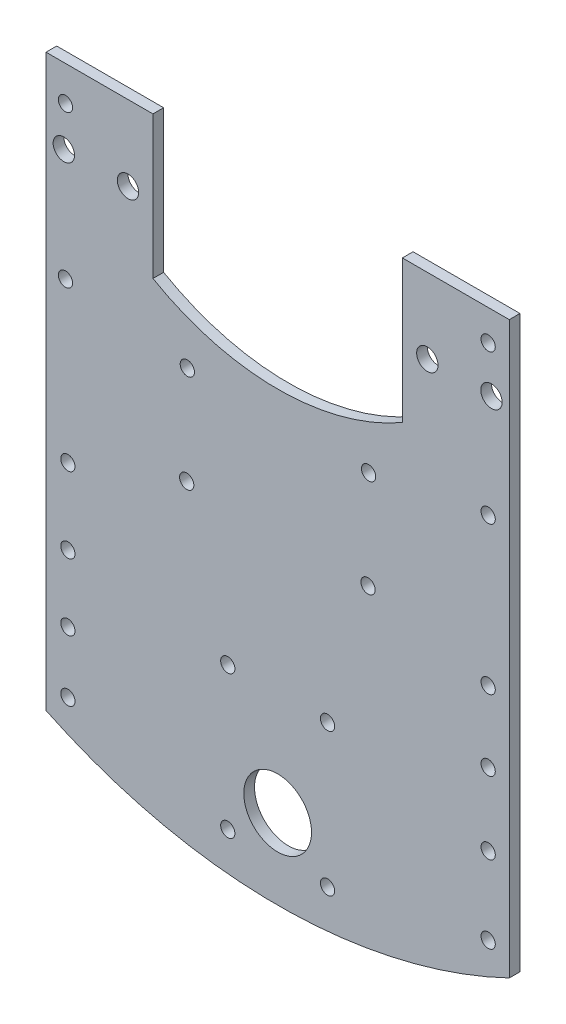
ISO-10303-21;
HEADER;
FILE_DESCRIPTION(('STEP AP214'),'2;1');
FILE_NAME('part.step','',(''),(''),'','','');
FILE_SCHEMA(('AUTOMOTIVE_DESIGN { 1 0 10303 214 1 1 1 1 }'));
ENDSEC;
DATA;
#1=APPLICATION_CONTEXT('core data for automotive mechanical design processes');
#2=APPLICATION_PROTOCOL_DEFINITION('international standard','automotive_design',2000,#1);
#3=PRODUCT_CONTEXT('',#1,'mechanical');
#4=PRODUCT('Part','Part','',(#3));
#5=PRODUCT_RELATED_PRODUCT_CATEGORY('part','',(#4));
#6=PRODUCT_DEFINITION_FORMATION('','',#4);
#7=PRODUCT_DEFINITION_CONTEXT('part definition',#1,'design');
#8=PRODUCT_DEFINITION('design','',#6,#7);
#9=PRODUCT_DEFINITION_SHAPE('','',#8);
#10=(LENGTH_UNIT() NAMED_UNIT(*) SI_UNIT(.MILLI.,.METRE.));
#11=(NAMED_UNIT(*) PLANE_ANGLE_UNIT() SI_UNIT($,.RADIAN.));
#12=(NAMED_UNIT(*) SI_UNIT($,.STERADIAN.) SOLID_ANGLE_UNIT());
#13=UNCERTAINTY_MEASURE_WITH_UNIT(LENGTH_MEASURE(1.E-05),#10,'distance_accuracy_value','');
#14=(GEOMETRIC_REPRESENTATION_CONTEXT(3) GLOBAL_UNCERTAINTY_ASSIGNED_CONTEXT((#13)) GLOBAL_UNIT_ASSIGNED_CONTEXT((#10,
#11,#12)) REPRESENTATION_CONTEXT('',''));
#15=CARTESIAN_POINT('',(0.,0.,0.));
#16=DIRECTION('',(0.,0.,1.));
#17=DIRECTION('',(1.,0.,0.));
#18=AXIS2_PLACEMENT_3D('',#15,#16,#17);
#19=CARTESIAN_POINT('',(0.82033483000224,16.841601103084,3.));
#20=DIRECTION('',(0.,0.,1.));
#21=DIRECTION('',(1.,0.,0.));
#22=AXIS2_PLACEMENT_3D('',#19,#20,#21);
#23=PLANE('',#22);
#24=CARTESIAN_POINT('',(-58.7353248928425,31.901332055439,3.));
#25=DIRECTION('',(0.,0.,1.));
#26=DIRECTION('',(1.,0.,0.));
#27=AXIS2_PLACEMENT_3D('',#24,#25,#26);
#28=CIRCLE('',#27,2.);
#29=CARTESIAN_POINT('',(-56.7353248928425,31.901332055439,3.));
#30=VERTEX_POINT('',#29);
#31=EDGE_CURVE('E494',#30,#30,#28,.T.);
#32=ORIENTED_EDGE('',*,*,#31,.F.);
#33=EDGE_LOOP('',(#32));
#34=FACE_BOUND('',#33,.T.);
#35=CARTESIAN_POINT('',(59.8926878247371,-112.115366711053,3.));
#36=DIRECTION('',(0.,0.,1.));
#37=DIRECTION('',(1.,0.,0.));
#38=AXIS2_PLACEMENT_3D('',#35,#36,#37);
#39=CIRCLE('',#38,2.);
#40=CARTESIAN_POINT('',(61.8926878247371,-112.115366711053,3.));
#41=VERTEX_POINT('',#40);
#42=EDGE_CURVE('E502',#41,#41,#39,.T.);
#43=ORIENTED_EDGE('',*,*,#42,.F.);
#44=EDGE_LOOP('',(#43));
#45=FACE_BOUND('',#44,.T.);
#46=CARTESIAN_POINT('',(59.8926878247371,-90.4055847690872,3.));
#47=DIRECTION('',(0.,0.,1.));
#48=DIRECTION('',(1.,0.,0.));
#49=AXIS2_PLACEMENT_3D('',#46,#47,#48);
#50=CIRCLE('',#49,2.);
#51=CARTESIAN_POINT('',(61.8926878247371,-90.4055847690872,3.));
#52=VERTEX_POINT('',#51);
#53=EDGE_CURVE('E505',#52,#52,#50,.T.);
#54=ORIENTED_EDGE('',*,*,#53,.F.);
#55=EDGE_LOOP('',(#54));
#56=FACE_BOUND('',#55,.T.);
#57=CARTESIAN_POINT('',(59.8926878247371,-70.121992881703,3.));
#58=DIRECTION('',(0.,0.,1.));
#59=DIRECTION('',(1.,0.,0.));
#60=AXIS2_PLACEMENT_3D('',#57,#58,#59);
#61=CIRCLE('',#60,2.);
#62=CARTESIAN_POINT('',(61.8926878247371,-70.121992881703,3.));
#63=VERTEX_POINT('',#62);
#64=EDGE_CURVE('E508',#63,#63,#61,.T.);
#65=ORIENTED_EDGE('',*,*,#64,.F.);
#66=EDGE_LOOP('',(#65));
#67=FACE_BOUND('',#66,.T.);
#68=CARTESIAN_POINT('',(-58.7353248928425,-10.7596293906167,3.));
#69=DIRECTION('',(0.,0.,1.));
#70=DIRECTION('',(1.,0.,0.));
#71=AXIS2_PLACEMENT_3D('',#68,#69,#70);
#72=CIRCLE('',#71,2.);
#73=CARTESIAN_POINT('',(-56.7353248928425,-10.7596293906167,3.));
#74=VERTEX_POINT('',#73);
#75=EDGE_CURVE('E490',#74,#74,#72,.T.);
#76=ORIENTED_EDGE('',*,*,#75,.F.);
#77=EDGE_LOOP('',(#76));
#78=FACE_BOUND('',#77,.T.);
#79=CARTESIAN_POINT('',(-58.0507536666432,-55.0285686848329,3.));
#80=DIRECTION('',(0.,0.,1.));
#81=DIRECTION('',(1.,0.,0.));
#82=AXIS2_PLACEMENT_3D('',#79,#80,#81);
#83=CIRCLE('',#82,2.);
#84=CARTESIAN_POINT('',(-56.0507536666432,-55.0285686848329,3.));
#85=VERTEX_POINT('',#84);
#86=EDGE_CURVE('E493',#85,#85,#83,.T.);
#87=ORIENTED_EDGE('',*,*,#86,.F.);
#88=EDGE_LOOP('',(#87));
#89=FACE_BOUND('',#88,.T.);
#90=CARTESIAN_POINT('',(-58.0507536666432,-76.2502766970087,3.));
#91=DIRECTION('',(0.,0.,1.));
#92=DIRECTION('',(1.,0.,0.));
#93=AXIS2_PLACEMENT_3D('',#90,#91,#92);
#94=CIRCLE('',#93,2.);
#95=CARTESIAN_POINT('',(-56.0507536666432,-76.2502766970087,3.));
#96=VERTEX_POINT('',#95);
#97=EDGE_CURVE('E497',#96,#96,#94,.T.);
#98=ORIENTED_EDGE('',*,*,#97,.F.);
#99=EDGE_LOOP('',(#98));
#100=FACE_BOUND('',#99,.T.);
#101=CARTESIAN_POINT('',(-58.0507536666432,-94.9618902131206,3.));
#102=DIRECTION('',(0.,0.,1.));
#103=DIRECTION('',(1.,0.,0.));
#104=AXIS2_PLACEMENT_3D('',#101,#102,#103);
#105=CIRCLE('',#104,2.);
#106=CARTESIAN_POINT('',(-56.0507536666432,-94.9618902131206,3.));
#107=VERTEX_POINT('',#106);
#108=EDGE_CURVE('E489',#107,#107,#105,.T.);
#109=ORIENTED_EDGE('',*,*,#108,.F.);
#110=EDGE_LOOP('',(#109));
#111=FACE_BOUND('',#110,.T.);
#112=CARTESIAN_POINT('',(59.8926878247371,-50.255835401353,3.));
#113=DIRECTION('',(0.,0.,1.));
#114=DIRECTION('',(1.,0.,0.));
#115=AXIS2_PLACEMENT_3D('',#112,#113,#114);
#116=CIRCLE('',#115,2.);
#117=CARTESIAN_POINT('',(61.8926878247371,-50.255835401353,3.));
#118=VERTEX_POINT('',#117);
#119=EDGE_CURVE('E414',#118,#118,#116,.T.);
#120=ORIENTED_EDGE('',*,*,#119,.F.);
#121=EDGE_LOOP('',(#120));
#122=FACE_BOUND('',#121,.T.);
#123=CARTESIAN_POINT('',(59.8926878247371,-8.82591075219494,3.));
#124=DIRECTION('',(0.,0.,1.));
#125=DIRECTION('',(1.,0.,0.));
#126=AXIS2_PLACEMENT_3D('',#123,#124,#125);
#127=CIRCLE('',#126,2.);
#128=CARTESIAN_POINT('',(61.8926878247371,-8.82591075219494,3.));
#129=VERTEX_POINT('',#128);
#130=EDGE_CURVE('E516',#129,#129,#127,.T.);
#131=ORIENTED_EDGE('',*,*,#130,.F.);
#132=EDGE_LOOP('',(#131));
#133=FACE_BOUND('',#132,.T.);
#134=CARTESIAN_POINT('',(59.8926878247371,33.0331101704914,3.));
#135=DIRECTION('',(0.,0.,1.));
#136=DIRECTION('',(1.,0.,0.));
#137=AXIS2_PLACEMENT_3D('',#134,#135,#136);
#138=CIRCLE('',#137,2.);
#139=CARTESIAN_POINT('',(61.8926878247371,33.0331101704914,3.));
#140=VERTEX_POINT('',#139);
#141=EDGE_CURVE('E513',#140,#140,#138,.T.);
#142=ORIENTED_EDGE('',*,*,#141,.F.);
#143=EDGE_LOOP('',(#142));
#144=FACE_BOUND('',#143,.T.);
#145=CARTESIAN_POINT('',(-58.0507536666432,-112.076170868101,3.));
#146=DIRECTION('',(0.,0.,1.));
#147=DIRECTION('',(1.,0.,0.));
#148=AXIS2_PLACEMENT_3D('',#145,#146,#147);
#149=CIRCLE('',#148,2.);
#150=CARTESIAN_POINT('',(-56.0507536666432,-112.076170868101,3.));
#151=VERTEX_POINT('',#150);
#152=EDGE_CURVE('E170',#151,#151,#149,.T.);
#153=ORIENTED_EDGE('',*,*,#152,.F.);
#154=EDGE_LOOP('',(#153));
#155=FACE_BOUND('',#154,.T.);
#156=CARTESIAN_POINT('',(-24.6990644063407,-42.8702786135747,3.));
#157=DIRECTION('',(0.,0.,1.));
#158=DIRECTION('',(1.,0.,0.));
#159=AXIS2_PLACEMENT_3D('',#156,#157,#158);
#160=CIRCLE('',#159,2.);
#161=CARTESIAN_POINT('',(-22.6990644063407,-42.8702786135747,3.));
#162=VERTEX_POINT('',#161);
#163=EDGE_CURVE('E205',#162,#162,#160,.F.);
#164=ORIENTED_EDGE('',*,*,#163,.T.);
#165=EDGE_LOOP('',(#164));
#166=FACE_BOUND('',#165,.T.);
#167=CARTESIAN_POINT('',(-24.52945484201,-15.2902786135747,3.));
#168=DIRECTION('',(0.,0.,1.));
#169=DIRECTION('',(1.,0.,0.));
#170=AXIS2_PLACEMENT_3D('',#167,#168,#169);
#171=CIRCLE('',#170,2.);
#172=CARTESIAN_POINT('',(-22.52945484201,-15.2902786135747,3.));
#173=VERTEX_POINT('',#172);
#174=EDGE_CURVE('E213',#173,#173,#171,.F.);
#175=ORIENTED_EDGE('',*,*,#174,.T.);
#176=EDGE_LOOP('',(#175));
#177=FACE_BOUND('',#176,.T.);
#178=CARTESIAN_POINT('',(26.3397340663453,-15.2902786135748,3.));
#179=DIRECTION('',(0.,0.,1.));
#180=DIRECTION('',(1.,0.,0.));
#181=AXIS2_PLACEMENT_3D('',#178,#179,#180);
#182=CIRCLE('',#181,2.);
#183=CARTESIAN_POINT('',(28.3397340663453,-15.2902786135748,3.));
#184=VERTEX_POINT('',#183);
#185=EDGE_CURVE('E220',#184,#184,#182,.F.);
#186=ORIENTED_EDGE('',*,*,#185,.T.);
#187=EDGE_LOOP('',(#186));
#188=FACE_BOUND('',#187,.T.);
#189=CARTESIAN_POINT('',(26.1701245020146,-42.8702786135748,3.));
#190=DIRECTION('',(0.,0.,1.));
#191=DIRECTION('',(1.,0.,0.));
#192=AXIS2_PLACEMENT_3D('',#189,#190,#191);
#193=CIRCLE('',#192,2.);
#194=CARTESIAN_POINT('',(28.1701245020146,-42.8702786135748,3.));
#195=VERTEX_POINT('',#194);
#196=EDGE_CURVE('E219',#195,#195,#193,.F.);
#197=ORIENTED_EDGE('',*,*,#196,.T.);
#198=EDGE_LOOP('',(#197));
#199=FACE_BOUND('',#198,.T.);
#200=CARTESIAN_POINT('',(-13.1796651699263,-121.721678977984,3.));
#201=DIRECTION('',(0.,0.,1.));
#202=DIRECTION('',(1.,0.,0.));
#203=AXIS2_PLACEMENT_3D('',#200,#201,#202);
#204=CIRCLE('',#203,2.);
#205=CARTESIAN_POINT('',(-11.1796651699263,-121.721678977984,3.));
#206=VERTEX_POINT('',#205);
#207=EDGE_CURVE('E235',#206,#206,#204,.F.);
#208=ORIENTED_EDGE('',*,*,#207,.T.);
#209=EDGE_LOOP('',(#208));
#210=FACE_BOUND('',#209,.T.);
#211=CARTESIAN_POINT('',(-13.1796651699439,-81.7216789779836,3.));
#212=DIRECTION('',(0.,0.,1.));
#213=DIRECTION('',(1.,0.,0.));
#214=AXIS2_PLACEMENT_3D('',#211,#212,#213);
#215=CIRCLE('',#214,2.);
#216=CARTESIAN_POINT('',(-11.1796651699439,-81.7216789779836,3.));
#217=VERTEX_POINT('',#216);
#218=EDGE_CURVE('E228',#217,#217,#215,.F.);
#219=ORIENTED_EDGE('',*,*,#218,.T.);
#220=EDGE_LOOP('',(#219));
#221=FACE_BOUND('',#220,.T.);
#222=CARTESIAN_POINT('',(14.8203348300561,-81.7216789779713,3.));
#223=DIRECTION('',(0.,0.,1.));
#224=DIRECTION('',(1.,0.,0.));
#225=AXIS2_PLACEMENT_3D('',#222,#223,#224);
#226=CIRCLE('',#225,2.);
#227=CARTESIAN_POINT('',(16.8203348300561,-81.7216789779713,3.));
#228=VERTEX_POINT('',#227);
#229=EDGE_CURVE('E227',#228,#228,#226,.F.);
#230=ORIENTED_EDGE('',*,*,#229,.T.);
#231=EDGE_LOOP('',(#230));
#232=FACE_BOUND('',#231,.T.);
#233=CARTESIAN_POINT('',(14.8203348300737,-121.721678977971,3.));
#234=DIRECTION('',(0.,0.,1.));
#235=DIRECTION('',(1.,0.,0.));
#236=AXIS2_PLACEMENT_3D('',#233,#234,#235);
#237=CIRCLE('',#236,2.);
#238=CARTESIAN_POINT('',(16.8203348300737,-121.721678977971,3.));
#239=VERTEX_POINT('',#238);
#240=EDGE_CURVE('E244',#239,#239,#237,.F.);
#241=ORIENTED_EDGE('',*,*,#240,.T.);
#242=EDGE_LOOP('',(#241));
#243=FACE_BOUND('',#242,.T.);
#244=CARTESIAN_POINT('',(0.820334830002261,-110.721678977963,3.));
#245=DIRECTION('',(0.,0.,1.));
#246=DIRECTION('',(1.,0.,0.));
#247=AXIS2_PLACEMENT_3D('',#244,#245,#246);
#248=CIRCLE('',#247,9.49999999999999);
#249=CARTESIAN_POINT('',(10.3203348300023,-110.721678977963,3.));
#250=VERTEX_POINT('',#249);
#251=EDGE_CURVE('E165',#250,#250,#248,.T.);
#252=ORIENTED_EDGE('',*,*,#251,.F.);
#253=EDGE_LOOP('',(#252));
#254=FACE_BOUND('',#253,.T.);
#255=CARTESIAN_POINT('',(-59.1796651699977,20.5544747081712,3.));
#256=DIRECTION('',(0.,0.,1.));
#257=DIRECTION('',(-1.,0.,0.));
#258=AXIS2_PLACEMENT_3D('',#255,#256,#257);
#259=CIRCLE('',#258,3.);
#260=CARTESIAN_POINT('',(-62.1796651699977,20.5544747081712,3.));
#261=VERTEX_POINT('',#260);
#262=EDGE_CURVE('E255',#261,#261,#259,.T.);
#263=ORIENTED_EDGE('',*,*,#262,.F.);
#264=EDGE_LOOP('',(#263));
#265=FACE_BOUND('',#264,.T.);
#266=CARTESIAN_POINT('',(60.8203348300023,20.5544747081712,3.));
#267=DIRECTION('',(0.,0.,1.));
#268=DIRECTION('',(1.,0.,0.));
#269=AXIS2_PLACEMENT_3D('',#266,#267,#268);
#270=CIRCLE('',#269,3.00000000000001);
#271=CARTESIAN_POINT('',(63.8203348300023,20.5544747081712,3.));
#272=VERTEX_POINT('',#271);
#273=EDGE_CURVE('E138',#272,#272,#270,.T.);
#274=ORIENTED_EDGE('',*,*,#273,.F.);
#275=EDGE_LOOP('',(#274));
#276=FACE_BOUND('',#275,.T.);
#277=DIRECTION('',(-1.,0.,0.));
#278=VECTOR('',#277,1.);
#279=CARTESIAN_POINT('',(-34.1796651699977,41.6565427571263,3.));
#280=LINE('',#279,#278);
#281=CARTESIAN_POINT('',(-34.1796651699977,41.6565427571263,3.));
#282=VERTEX_POINT('',#281);
#283=CARTESIAN_POINT('',(-64.1796651699977,41.6565427571263,3.));
#284=VERTEX_POINT('',#283);
#285=EDGE_CURVE('E149',#282,#284,#280,.T.);
#286=ORIENTED_EDGE('',*,*,#285,.T.);
#287=DIRECTION('',(0.,-1.,0.));
#288=VECTOR('',#287,1.);
#289=CARTESIAN_POINT('',(-64.1796651699977,41.6565427571263,3.));
#290=LINE('',#289,#288);
#291=CARTESIAN_POINT('',(-64.1796651699978,-118.343457242874,3.));
#292=VERTEX_POINT('',#291);
#293=EDGE_CURVE('E97',#284,#292,#290,.T.);
#294=ORIENTED_EDGE('',*,*,#293,.T.);
#295=CARTESIAN_POINT('',(0.82033483000224,16.841601103084,3.));
#296=DIRECTION('',(0.,0.,1.));
#297=DIRECTION('',(1.,0.,0.));
#298=AXIS2_PLACEMENT_3D('',#295,#296,#297);
#299=CIRCLE('',#298,150.);
#300=CARTESIAN_POINT('',(65.8203348300023,-118.343457242874,3.));
#301=VERTEX_POINT('',#300);
#302=EDGE_CURVE('E273',#292,#301,#299,.T.);
#303=ORIENTED_EDGE('',*,*,#302,.T.);
#304=DIRECTION('',(0.,1.,0.));
#305=VECTOR('',#304,1.);
#306=CARTESIAN_POINT('',(65.8203348300023,-118.343457242874,3.));
#307=LINE('',#306,#305);
#308=CARTESIAN_POINT('',(65.8203348300023,41.6565427571263,3.));
#309=VERTEX_POINT('',#308);
#310=EDGE_CURVE('E275',#301,#309,#307,.T.);
#311=ORIENTED_EDGE('',*,*,#310,.T.);
#312=DIRECTION('',(-1.,0.,0.));
#313=VECTOR('',#312,1.);
#314=CARTESIAN_POINT('',(65.8203348300023,41.6565427571263,3.));
#315=LINE('',#314,#313);
#316=CARTESIAN_POINT('',(35.8203348300023,41.6565427571263,3.));
#317=VERTEX_POINT('',#316);
#318=EDGE_CURVE('E116',#309,#317,#315,.T.);
#319=ORIENTED_EDGE('',*,*,#318,.T.);
#320=DIRECTION('',(0.,-1.,0.));
#321=VECTOR('',#320,1.);
#322=CARTESIAN_POINT('',(35.8203348300023,41.6565427571263,3.));
#323=LINE('',#322,#321);
#324=CARTESIAN_POINT('',(35.8203348300023,1.65654275712631,3.));
#325=VERTEX_POINT('',#324);
#326=EDGE_CURVE('E110',#317,#325,#323,.T.);
#327=ORIENTED_EDGE('',*,*,#326,.T.);
#328=CARTESIAN_POINT('',(0.82033483000224,62.278321022037,3.));
#329=DIRECTION('',(0.,0.,-1.));
#330=DIRECTION('',(1.,0.,0.));
#331=AXIS2_PLACEMENT_3D('',#328,#329,#330);
#332=CIRCLE('',#331,70.);
#333=CARTESIAN_POINT('',(-34.1796651699977,1.65654275712625,3.));
#334=VERTEX_POINT('',#333);
#335=EDGE_CURVE('E114',#325,#334,#332,.T.);
#336=ORIENTED_EDGE('',*,*,#335,.T.);
#337=DIRECTION('',(0.,1.,0.));
#338=VECTOR('',#337,1.);
#339=CARTESIAN_POINT('',(-34.1796651699977,1.65654275712625,3.));
#340=LINE('',#339,#338);
#341=EDGE_CURVE('E54',#334,#282,#340,.T.);
#342=ORIENTED_EDGE('',*,*,#341,.T.);
#343=EDGE_LOOP('',(#286,#294,#303,#311,#319,#327,#336,#342));
#344=FACE_BOUND('',#343,.T.);
#345=CARTESIAN_POINT('',(42.8203348300023,20.5544747081712,3.));
#346=DIRECTION('',(0.,0.,1.));
#347=DIRECTION('',(1.,0.,0.));
#348=AXIS2_PLACEMENT_3D('',#345,#346,#347);
#349=CIRCLE('',#348,2.99999999999999);
#350=CARTESIAN_POINT('',(45.8203348300023,20.5544747081712,3.));
#351=VERTEX_POINT('',#350);
#352=EDGE_CURVE('E261',#351,#351,#349,.T.);
#353=ORIENTED_EDGE('',*,*,#352,.F.);
#354=EDGE_LOOP('',(#353));
#355=FACE_BOUND('',#354,.T.);
#356=CARTESIAN_POINT('',(-41.1796651699977,20.5544747081712,3.));
#357=DIRECTION('',(0.,0.,1.));
#358=DIRECTION('',(-1.,0.,0.));
#359=AXIS2_PLACEMENT_3D('',#356,#357,#358);
#360=CIRCLE('',#359,2.99999999999999);
#361=CARTESIAN_POINT('',(-44.1796651699977,20.5544747081712,3.));
#362=VERTEX_POINT('',#361);
#363=EDGE_CURVE('E249',#362,#362,#360,.T.);
#364=ORIENTED_EDGE('',*,*,#363,.F.);
#365=EDGE_LOOP('',(#364));
#366=FACE_BOUND('',#365,.T.);
#367=ADVANCED_FACE('F35',(#34,#45,#56,#67,#78,#89,#100,#111,#122,#133,#144,#155,#166,#177,#188,
#199,#210,#221,#232,#243,#254,#265,#276,#344,#355,#366),#23,.T.);
#368=CARTESIAN_POINT('',(0.82033483000224,16.841601103084,0.));
#369=DIRECTION('',(0.,0.,1.));
#370=DIRECTION('',(1.,0.,0.));
#371=AXIS2_PLACEMENT_3D('',#368,#369,#370);
#372=PLANE('',#371);
#373=CARTESIAN_POINT('',(-58.7353248928425,31.901332055439,0.));
#374=DIRECTION('',(0.,0.,1.));
#375=DIRECTION('',(1.,0.,0.));
#376=AXIS2_PLACEMENT_3D('',#373,#374,#375);
#377=CIRCLE('',#376,2.);
#378=CARTESIAN_POINT('',(-56.7353248928425,31.901332055439,0.));
#379=VERTEX_POINT('',#378);
#380=EDGE_CURVE('E39',#379,#379,#377,.T.);
#381=ORIENTED_EDGE('',*,*,#380,.T.);
#382=EDGE_LOOP('',(#381));
#383=FACE_BOUND('',#382,.T.);
#384=CARTESIAN_POINT('',(59.8926878247371,-112.115366711053,0.));
#385=DIRECTION('',(0.,0.,1.));
#386=DIRECTION('',(1.,0.,0.));
#387=AXIS2_PLACEMENT_3D('',#384,#385,#386);
#388=CIRCLE('',#387,2.);
#389=CARTESIAN_POINT('',(61.8926878247371,-112.115366711053,0.));
#390=VERTEX_POINT('',#389);
#391=EDGE_CURVE('E196',#390,#390,#388,.T.);
#392=ORIENTED_EDGE('',*,*,#391,.T.);
#393=EDGE_LOOP('',(#392));
#394=FACE_BOUND('',#393,.T.);
#395=CARTESIAN_POINT('',(59.8926878247371,-90.4055847690872,0.));
#396=DIRECTION('',(0.,0.,1.));
#397=DIRECTION('',(1.,0.,0.));
#398=AXIS2_PLACEMENT_3D('',#395,#396,#397);
#399=CIRCLE('',#398,2.);
#400=CARTESIAN_POINT('',(61.8926878247371,-90.4055847690872,0.));
#401=VERTEX_POINT('',#400);
#402=EDGE_CURVE('E194',#401,#401,#399,.T.);
#403=ORIENTED_EDGE('',*,*,#402,.T.);
#404=EDGE_LOOP('',(#403));
#405=FACE_BOUND('',#404,.T.);
#406=CARTESIAN_POINT('',(59.8926878247371,-70.121992881703,0.));
#407=DIRECTION('',(0.,0.,1.));
#408=DIRECTION('',(1.,0.,0.));
#409=AXIS2_PLACEMENT_3D('',#406,#407,#408);
#410=CIRCLE('',#409,2.);
#411=CARTESIAN_POINT('',(61.8926878247371,-70.121992881703,0.));
#412=VERTEX_POINT('',#411);
#413=EDGE_CURVE('E191',#412,#412,#410,.T.);
#414=ORIENTED_EDGE('',*,*,#413,.T.);
#415=EDGE_LOOP('',(#414));
#416=FACE_BOUND('',#415,.T.);
#417=CARTESIAN_POINT('',(-58.7353248928425,-10.7596293906167,0.));
#418=DIRECTION('',(0.,0.,1.));
#419=DIRECTION('',(1.,0.,0.));
#420=AXIS2_PLACEMENT_3D('',#417,#418,#419);
#421=CIRCLE('',#420,2.);
#422=CARTESIAN_POINT('',(-56.7353248928425,-10.7596293906167,0.));
#423=VERTEX_POINT('',#422);
#424=EDGE_CURVE('E188',#423,#423,#421,.T.);
#425=ORIENTED_EDGE('',*,*,#424,.T.);
#426=EDGE_LOOP('',(#425));
#427=FACE_BOUND('',#426,.T.);
#428=CARTESIAN_POINT('',(-58.0507536666432,-55.0285686848329,0.));
#429=DIRECTION('',(0.,0.,1.));
#430=DIRECTION('',(1.,0.,0.));
#431=AXIS2_PLACEMENT_3D('',#428,#429,#430);
#432=CIRCLE('',#431,2.);
#433=CARTESIAN_POINT('',(-56.0507536666432,-55.0285686848329,0.));
#434=VERTEX_POINT('',#433);
#435=EDGE_CURVE('E185',#434,#434,#432,.T.);
#436=ORIENTED_EDGE('',*,*,#435,.T.);
#437=EDGE_LOOP('',(#436));
#438=FACE_BOUND('',#437,.T.);
#439=CARTESIAN_POINT('',(-58.0507536666432,-76.2502766970087,0.));
#440=DIRECTION('',(0.,0.,1.));
#441=DIRECTION('',(1.,0.,0.));
#442=AXIS2_PLACEMENT_3D('',#439,#440,#441);
#443=CIRCLE('',#442,2.);
#444=CARTESIAN_POINT('',(-56.0507536666432,-76.2502766970087,0.));
#445=VERTEX_POINT('',#444);
#446=EDGE_CURVE('E182',#445,#445,#443,.T.);
#447=ORIENTED_EDGE('',*,*,#446,.T.);
#448=EDGE_LOOP('',(#447));
#449=FACE_BOUND('',#448,.T.);
#450=CARTESIAN_POINT('',(-58.0507536666432,-94.9618902131206,0.));
#451=DIRECTION('',(0.,0.,1.));
#452=DIRECTION('',(1.,0.,0.));
#453=AXIS2_PLACEMENT_3D('',#450,#451,#452);
#454=CIRCLE('',#453,2.);
#455=CARTESIAN_POINT('',(-56.0507536666432,-94.9618902131206,0.));
#456=VERTEX_POINT('',#455);
#457=EDGE_CURVE('E179',#456,#456,#454,.T.);
#458=ORIENTED_EDGE('',*,*,#457,.T.);
#459=EDGE_LOOP('',(#458));
#460=FACE_BOUND('',#459,.T.);
#461=CARTESIAN_POINT('',(59.8926878247371,-50.255835401353,0.));
#462=DIRECTION('',(0.,0.,1.));
#463=DIRECTION('',(1.,0.,0.));
#464=AXIS2_PLACEMENT_3D('',#461,#462,#463);
#465=CIRCLE('',#464,2.);
#466=CARTESIAN_POINT('',(61.8926878247371,-50.255835401353,0.));
#467=VERTEX_POINT('',#466);
#468=EDGE_CURVE('E176',#467,#467,#465,.T.);
#469=ORIENTED_EDGE('',*,*,#468,.T.);
#470=EDGE_LOOP('',(#469));
#471=FACE_BOUND('',#470,.T.);
#472=CARTESIAN_POINT('',(59.8926878247371,-8.82591075219494,0.));
#473=DIRECTION('',(0.,0.,1.));
#474=DIRECTION('',(1.,0.,0.));
#475=AXIS2_PLACEMENT_3D('',#472,#473,#474);
#476=CIRCLE('',#475,2.);
#477=CARTESIAN_POINT('',(61.8926878247371,-8.82591075219494,0.));
#478=VERTEX_POINT('',#477);
#479=EDGE_CURVE('E173',#478,#478,#476,.T.);
#480=ORIENTED_EDGE('',*,*,#479,.T.);
#481=EDGE_LOOP('',(#480));
#482=FACE_BOUND('',#481,.T.);
#483=CARTESIAN_POINT('',(59.8926878247371,33.0331101704914,0.));
#484=DIRECTION('',(0.,0.,1.));
#485=DIRECTION('',(1.,0.,0.));
#486=AXIS2_PLACEMENT_3D('',#483,#484,#485);
#487=CIRCLE('',#486,2.);
#488=CARTESIAN_POINT('',(61.8926878247371,33.0331101704914,0.));
#489=VERTEX_POINT('',#488);
#490=EDGE_CURVE('E169',#489,#489,#487,.T.);
#491=ORIENTED_EDGE('',*,*,#490,.T.);
#492=EDGE_LOOP('',(#491));
#493=FACE_BOUND('',#492,.T.);
#494=CARTESIAN_POINT('',(-58.0507536666432,-112.076170868101,0.));
#495=DIRECTION('',(0.,0.,1.));
#496=DIRECTION('',(1.,0.,0.));
#497=AXIS2_PLACEMENT_3D('',#494,#495,#496);
#498=CIRCLE('',#497,2.);
#499=CARTESIAN_POINT('',(-56.0507536666432,-112.076170868101,0.));
#500=VERTEX_POINT('',#499);
#501=EDGE_CURVE('E166',#500,#500,#498,.T.);
#502=ORIENTED_EDGE('',*,*,#501,.T.);
#503=EDGE_LOOP('',(#502));
#504=FACE_BOUND('',#503,.T.);
#505=CARTESIAN_POINT('',(-24.6990644063407,-42.8702786135747,0.));
#506=DIRECTION('',(0.,0.,-1.));
#507=DIRECTION('',(-1.,0.,0.));
#508=AXIS2_PLACEMENT_3D('',#505,#506,#507);
#509=CIRCLE('',#508,2.);
#510=CARTESIAN_POINT('',(-26.6990644063407,-42.8702786135747,0.));
#511=VERTEX_POINT('',#510);
#512=EDGE_CURVE('E201',#511,#511,#509,.T.);
#513=ORIENTED_EDGE('',*,*,#512,.F.);
#514=EDGE_LOOP('',(#513));
#515=FACE_BOUND('',#514,.T.);
#516=CARTESIAN_POINT('',(-24.52945484201,-15.2902786135747,0.));
#517=DIRECTION('',(0.,0.,-1.));
#518=DIRECTION('',(-1.,0.,0.));
#519=AXIS2_PLACEMENT_3D('',#516,#517,#518);
#520=CIRCLE('',#519,2.);
#521=CARTESIAN_POINT('',(-26.52945484201,-15.2902786135747,0.));
#522=VERTEX_POINT('',#521);
#523=EDGE_CURVE('E210',#522,#522,#520,.T.);
#524=ORIENTED_EDGE('',*,*,#523,.F.);
#525=EDGE_LOOP('',(#524));
#526=FACE_BOUND('',#525,.T.);
#527=CARTESIAN_POINT('',(26.3397340663453,-15.2902786135748,0.));
#528=DIRECTION('',(0.,0.,-1.));
#529=DIRECTION('',(-1.,0.,0.));
#530=AXIS2_PLACEMENT_3D('',#527,#528,#529);
#531=CIRCLE('',#530,2.);
#532=CARTESIAN_POINT('',(24.3397340663453,-15.2902786135748,0.));
#533=VERTEX_POINT('',#532);
#534=EDGE_CURVE('E431',#533,#533,#531,.T.);
#535=ORIENTED_EDGE('',*,*,#534,.F.);
#536=EDGE_LOOP('',(#535));
#537=FACE_BOUND('',#536,.T.);
#538=CARTESIAN_POINT('',(26.1701245020146,-42.8702786135748,0.));
#539=DIRECTION('',(0.,0.,-1.));
#540=DIRECTION('',(-1.,0.,0.));
#541=AXIS2_PLACEMENT_3D('',#538,#539,#540);
#542=CIRCLE('',#541,2.);
#543=CARTESIAN_POINT('',(24.1701245020146,-42.8702786135748,0.));
#544=VERTEX_POINT('',#543);
#545=EDGE_CURVE('E216',#544,#544,#542,.T.);
#546=ORIENTED_EDGE('',*,*,#545,.F.);
#547=EDGE_LOOP('',(#546));
#548=FACE_BOUND('',#547,.T.);
#549=CARTESIAN_POINT('',(-13.1796651699263,-121.721678977984,0.));
#550=DIRECTION('',(0.,0.,-1.));
#551=DIRECTION('',(-1.,0.,0.));
#552=AXIS2_PLACEMENT_3D('',#549,#550,#551);
#553=CIRCLE('',#552,2.);
#554=CARTESIAN_POINT('',(-15.1796651699263,-121.721678977984,0.));
#555=VERTEX_POINT('',#554);
#556=EDGE_CURVE('E223',#555,#555,#553,.T.);
#557=ORIENTED_EDGE('',*,*,#556,.F.);
#558=EDGE_LOOP('',(#557));
#559=FACE_BOUND('',#558,.T.);
#560=CARTESIAN_POINT('',(-13.1796651699439,-81.7216789779836,0.));
#561=DIRECTION('',(0.,0.,-1.));
#562=DIRECTION('',(-1.,0.,0.));
#563=AXIS2_PLACEMENT_3D('',#560,#561,#562);
#564=CIRCLE('',#563,2.);
#565=CARTESIAN_POINT('',(-15.1796651699439,-81.7216789779836,0.));
#566=VERTEX_POINT('',#565);
#567=EDGE_CURVE('E232',#566,#566,#564,.T.);
#568=ORIENTED_EDGE('',*,*,#567,.F.);
#569=EDGE_LOOP('',(#568));
#570=FACE_BOUND('',#569,.T.);
#571=CARTESIAN_POINT('',(14.8203348300561,-81.7216789779713,0.));
#572=DIRECTION('',(0.,0.,-1.));
#573=DIRECTION('',(-1.,0.,0.));
#574=AXIS2_PLACEMENT_3D('',#571,#572,#573);
#575=CIRCLE('',#574,2.);
#576=CARTESIAN_POINT('',(12.8203348300561,-81.7216789779713,0.));
#577=VERTEX_POINT('',#576);
#578=EDGE_CURVE('E224',#577,#577,#575,.T.);
#579=ORIENTED_EDGE('',*,*,#578,.F.);
#580=EDGE_LOOP('',(#579));
#581=FACE_BOUND('',#580,.T.);
#582=CARTESIAN_POINT('',(14.8203348300737,-121.721678977971,0.));
#583=DIRECTION('',(0.,0.,-1.));
#584=DIRECTION('',(-1.,0.,0.));
#585=AXIS2_PLACEMENT_3D('',#582,#583,#584);
#586=CIRCLE('',#585,2.);
#587=CARTESIAN_POINT('',(12.8203348300737,-121.721678977971,0.));
#588=VERTEX_POINT('',#587);
#589=EDGE_CURVE('E231',#588,#588,#586,.T.);
#590=ORIENTED_EDGE('',*,*,#589,.F.);
#591=EDGE_LOOP('',(#590));
#592=FACE_BOUND('',#591,.T.);
#593=CARTESIAN_POINT('',(0.820334830002261,-110.721678977963,0.));
#594=DIRECTION('',(0.,0.,1.));
#595=DIRECTION('',(1.,0.,0.));
#596=AXIS2_PLACEMENT_3D('',#593,#594,#595);
#597=CIRCLE('',#596,9.49999999999999);
#598=CARTESIAN_POINT('',(10.3203348300023,-110.721678977963,0.));
#599=VERTEX_POINT('',#598);
#600=EDGE_CURVE('E161',#599,#599,#597,.T.);
#601=ORIENTED_EDGE('',*,*,#600,.T.);
#602=EDGE_LOOP('',(#601));
#603=FACE_BOUND('',#602,.T.);
#604=DIRECTION('',(-1.,0.,0.));
#605=VECTOR('',#604,1.);
#606=CARTESIAN_POINT('',(-34.1796651699977,41.6565427571263,0.));
#607=LINE('',#606,#605);
#608=CARTESIAN_POINT('',(-34.1796651699977,41.6565427571263,0.));
#609=VERTEX_POINT('',#608);
#610=CARTESIAN_POINT('',(-64.1796651699977,41.6565427571263,0.));
#611=VERTEX_POINT('',#610);
#612=EDGE_CURVE('E134',#609,#611,#607,.T.);
#613=ORIENTED_EDGE('',*,*,#612,.F.);
#614=DIRECTION('',(0.,1.,0.));
#615=VECTOR('',#614,1.);
#616=CARTESIAN_POINT('',(-34.1796651699977,1.65654275712625,0.));
#617=LINE('',#616,#615);
#618=CARTESIAN_POINT('',(-34.1796651699977,1.65654275712625,0.));
#619=VERTEX_POINT('',#618);
#620=EDGE_CURVE('E89',#619,#609,#617,.T.);
#621=ORIENTED_EDGE('',*,*,#620,.F.);
#622=CARTESIAN_POINT('',(0.82033483000224,62.278321022037,0.));
#623=DIRECTION('',(0.,0.,-1.));
#624=DIRECTION('',(1.,0.,0.));
#625=AXIS2_PLACEMENT_3D('',#622,#623,#624);
#626=CIRCLE('',#625,70.);
#627=CARTESIAN_POINT('',(35.8203348300023,1.65654275712631,0.));
#628=VERTEX_POINT('',#627);
#629=EDGE_CURVE('E83',#628,#619,#626,.T.);
#630=ORIENTED_EDGE('',*,*,#629,.F.);
#631=DIRECTION('',(0.,-1.,0.));
#632=VECTOR('',#631,1.);
#633=CARTESIAN_POINT('',(35.8203348300023,41.6565427571263,0.));
#634=LINE('',#633,#632);
#635=CARTESIAN_POINT('',(35.8203348300023,41.6565427571263,0.));
#636=VERTEX_POINT('',#635);
#637=EDGE_CURVE('E124',#636,#628,#634,.T.);
#638=ORIENTED_EDGE('',*,*,#637,.F.);
#639=DIRECTION('',(-1.,0.,0.));
#640=VECTOR('',#639,1.);
#641=CARTESIAN_POINT('',(65.8203348300023,41.6565427571263,0.));
#642=LINE('',#641,#640);
#643=CARTESIAN_POINT('',(65.8203348300023,41.6565427571263,0.));
#644=VERTEX_POINT('',#643);
#645=EDGE_CURVE('E144',#644,#636,#642,.T.);
#646=ORIENTED_EDGE('',*,*,#645,.F.);
#647=DIRECTION('',(0.,1.,0.));
#648=VECTOR('',#647,1.);
#649=CARTESIAN_POINT('',(65.8203348300023,-118.343457242874,0.));
#650=LINE('',#649,#648);
#651=CARTESIAN_POINT('',(65.8203348300023,-118.343457242874,0.));
#652=VERTEX_POINT('',#651);
#653=EDGE_CURVE('E142',#652,#644,#650,.T.);
#654=ORIENTED_EDGE('',*,*,#653,.F.);
#655=CARTESIAN_POINT('',(0.82033483000224,16.841601103084,0.));
#656=DIRECTION('',(0.,0.,1.));
#657=DIRECTION('',(1.,0.,0.));
#658=AXIS2_PLACEMENT_3D('',#655,#656,#657);
#659=CIRCLE('',#658,150.);
#660=CARTESIAN_POINT('',(-64.1796651699978,-118.343457242874,0.));
#661=VERTEX_POINT('',#660);
#662=EDGE_CURVE('E140',#661,#652,#659,.T.);
#663=ORIENTED_EDGE('',*,*,#662,.F.);
#664=DIRECTION('',(0.,-1.,0.));
#665=VECTOR('',#664,1.);
#666=CARTESIAN_POINT('',(-64.1796651699977,41.6565427571263,0.));
#667=LINE('',#666,#665);
#668=EDGE_CURVE('E137',#611,#661,#667,.T.);
#669=ORIENTED_EDGE('',*,*,#668,.F.);
#670=EDGE_LOOP('',(#613,#621,#630,#638,#646,#654,#663,#669));
#671=FACE_BOUND('',#670,.T.);
#672=CARTESIAN_POINT('',(60.8203348300023,20.5544747081712,0.));
#673=DIRECTION('',(0.,0.,1.));
#674=DIRECTION('',(1.,0.,0.));
#675=AXIS2_PLACEMENT_3D('',#672,#673,#674);
#676=CIRCLE('',#675,3.00000000000001);
#677=CARTESIAN_POINT('',(63.8203348300023,20.5544747081712,0.));
#678=VERTEX_POINT('',#677);
#679=EDGE_CURVE('E264',#678,#678,#676,.T.);
#680=ORIENTED_EDGE('',*,*,#679,.T.);
#681=EDGE_LOOP('',(#680));
#682=FACE_BOUND('',#681,.T.);
#683=CARTESIAN_POINT('',(42.8203348300023,20.5544747081712,0.));
#684=DIRECTION('',(0.,0.,1.));
#685=DIRECTION('',(1.,0.,0.));
#686=AXIS2_PLACEMENT_3D('',#683,#684,#685);
#687=CIRCLE('',#686,2.99999999999999);
#688=CARTESIAN_POINT('',(45.8203348300023,20.5544747081712,0.));
#689=VERTEX_POINT('',#688);
#690=EDGE_CURVE('E258',#689,#689,#687,.T.);
#691=ORIENTED_EDGE('',*,*,#690,.T.);
#692=EDGE_LOOP('',(#691));
#693=FACE_BOUND('',#692,.T.);
#694=CARTESIAN_POINT('',(-59.1796651699977,20.5544747081712,0.));
#695=DIRECTION('',(0.,0.,1.));
#696=DIRECTION('',(-1.,0.,0.));
#697=AXIS2_PLACEMENT_3D('',#694,#695,#696);
#698=CIRCLE('',#697,3.);
#699=CARTESIAN_POINT('',(-62.1796651699977,20.5544747081712,0.));
#700=VERTEX_POINT('',#699);
#701=EDGE_CURVE('E252',#700,#700,#698,.T.);
#702=ORIENTED_EDGE('',*,*,#701,.T.);
#703=EDGE_LOOP('',(#702));
#704=FACE_BOUND('',#703,.T.);
#705=CARTESIAN_POINT('',(-41.1796651699977,20.5544747081712,0.));
#706=DIRECTION('',(0.,0.,1.));
#707=DIRECTION('',(-1.,0.,0.));
#708=AXIS2_PLACEMENT_3D('',#705,#706,#707);
#709=CIRCLE('',#708,2.99999999999999);
#710=CARTESIAN_POINT('',(-44.1796651699977,20.5544747081712,0.));
#711=VERTEX_POINT('',#710);
#712=EDGE_CURVE('E164',#711,#711,#709,.T.);
#713=ORIENTED_EDGE('',*,*,#712,.T.);
#714=EDGE_LOOP('',(#713));
#715=FACE_BOUND('',#714,.T.);
#716=ADVANCED_FACE('F288',(#383,#394,#405,#416,#427,#438,#449,#460,#471,#482,#493,#504,#515,
#526,#537,#548,#559,#570,#581,#592,#603,#671,#682,#693,#704,#715),#372,.F.);
#717=CARTESIAN_POINT('',(-34.1796651699977,41.6565427571263,3.));
#718=DIRECTION('',(0.,-1.,0.));
#719=DIRECTION('',(0.,0.,-1.));
#720=AXIS2_PLACEMENT_3D('',#717,#718,#719);
#721=PLANE('',#720);
#722=ORIENTED_EDGE('',*,*,#612,.T.);
#723=DIRECTION('',(0.,0.,-1.));
#724=VECTOR('',#723,1.);
#725=CARTESIAN_POINT('',(-64.1796651699977,41.6565427571263,3.));
#726=LINE('',#725,#724);
#727=EDGE_CURVE('E11',#284,#611,#726,.T.);
#728=ORIENTED_EDGE('',*,*,#727,.F.);
#729=ORIENTED_EDGE('',*,*,#285,.F.);
#730=DIRECTION('',(0.,0.,-1.));
#731=VECTOR('',#730,1.);
#732=CARTESIAN_POINT('',(-34.1796651699977,41.6565427571263,3.));
#733=LINE('',#732,#731);
#734=EDGE_CURVE('E130',#282,#609,#733,.T.);
#735=ORIENTED_EDGE('',*,*,#734,.T.);
#736=EDGE_LOOP('',(#722,#728,#729,#735));
#737=FACE_BOUND('',#736,.T.);
#738=ADVANCED_FACE('F37',(#737),#721,.F.);
#739=CARTESIAN_POINT('',(-64.1796651699977,41.6565427571263,3.));
#740=DIRECTION('',(1.,0.,0.));
#741=DIRECTION('',(0.,0.,-1.));
#742=AXIS2_PLACEMENT_3D('',#739,#740,#741);
#743=PLANE('',#742);
#744=ORIENTED_EDGE('',*,*,#668,.T.);
#745=DIRECTION('',(0.,0.,-1.));
#746=VECTOR('',#745,1.);
#747=CARTESIAN_POINT('',(-64.1796651699978,-118.343457242874,3.));
#748=LINE('',#747,#746);
#749=EDGE_CURVE('E45',#292,#661,#748,.T.);
#750=ORIENTED_EDGE('',*,*,#749,.F.);
#751=ORIENTED_EDGE('',*,*,#293,.F.);
#752=ORIENTED_EDGE('',*,*,#727,.T.);
#753=EDGE_LOOP('',(#744,#750,#751,#752));
#754=FACE_BOUND('',#753,.T.);
#755=ADVANCED_FACE('F736',(#754),#743,.F.);
#756=CARTESIAN_POINT('',(0.82033483000224,16.841601103084,3.));
#757=DIRECTION('',(0.,0.,-1.));
#758=DIRECTION('',(-1.,0.,0.));
#759=AXIS2_PLACEMENT_3D('',#756,#757,#758);
#760=CYLINDRICAL_SURFACE('',#759,150.);
#761=ORIENTED_EDGE('',*,*,#662,.T.);
#762=DIRECTION('',(0.,0.,-1.));
#763=VECTOR('',#762,1.);
#764=CARTESIAN_POINT('',(65.8203348300023,-118.343457242874,3.));
#765=LINE('',#764,#763);
#766=EDGE_CURVE('E156',#301,#652,#765,.T.);
#767=ORIENTED_EDGE('',*,*,#766,.F.);
#768=ORIENTED_EDGE('',*,*,#302,.F.);
#769=ORIENTED_EDGE('',*,*,#749,.T.);
#770=EDGE_LOOP('',(#761,#767,#768,#769));
#771=FACE_BOUND('',#770,.T.);
#772=ADVANCED_FACE('F728',(#771),#760,.T.);
#773=CARTESIAN_POINT('',(65.8203348300023,-118.343457242874,3.));
#774=DIRECTION('',(-1.,0.,0.));
#775=DIRECTION('',(0.,0.,1.));
#776=AXIS2_PLACEMENT_3D('',#773,#774,#775);
#777=PLANE('',#776);
#778=ORIENTED_EDGE('',*,*,#653,.T.);
#779=DIRECTION('',(0.,0.,-1.));
#780=VECTOR('',#779,1.);
#781=CARTESIAN_POINT('',(65.8203348300023,41.6565427571263,3.));
#782=LINE('',#781,#780);
#783=EDGE_CURVE('E153',#309,#644,#782,.T.);
#784=ORIENTED_EDGE('',*,*,#783,.F.);
#785=ORIENTED_EDGE('',*,*,#310,.F.);
#786=ORIENTED_EDGE('',*,*,#766,.T.);
#787=EDGE_LOOP('',(#778,#784,#785,#786));
#788=FACE_BOUND('',#787,.T.);
#789=ADVANCED_FACE('F281',(#788),#777,.F.);
#790=CARTESIAN_POINT('',(65.8203348300023,41.6565427571263,3.));
#791=DIRECTION('',(0.,-1.,0.));
#792=DIRECTION('',(0.,0.,-1.));
#793=AXIS2_PLACEMENT_3D('',#790,#791,#792);
#794=PLANE('',#793);
#795=ORIENTED_EDGE('',*,*,#645,.T.);
#796=DIRECTION('',(0.,0.,-1.));
#797=VECTOR('',#796,1.);
#798=CARTESIAN_POINT('',(35.8203348300023,41.6565427571263,3.));
#799=LINE('',#798,#797);
#800=EDGE_CURVE('E125',#317,#636,#799,.T.);
#801=ORIENTED_EDGE('',*,*,#800,.F.);
#802=ORIENTED_EDGE('',*,*,#318,.F.);
#803=ORIENTED_EDGE('',*,*,#783,.T.);
#804=EDGE_LOOP('',(#795,#801,#802,#803));
#805=FACE_BOUND('',#804,.T.);
#806=ADVANCED_FACE('F285',(#805),#794,.F.);
#807=CARTESIAN_POINT('',(35.8203348300023,41.6565427571263,3.));
#808=DIRECTION('',(1.,0.,0.));
#809=DIRECTION('',(0.,1.,0.));
#810=AXIS2_PLACEMENT_3D('',#807,#808,#809);
#811=PLANE('',#810);
#812=ORIENTED_EDGE('',*,*,#637,.T.);
#813=DIRECTION('',(0.,0.,-1.));
#814=VECTOR('',#813,1.);
#815=CARTESIAN_POINT('',(35.8203348300023,1.65654275712631,3.));
#816=LINE('',#815,#814);
#817=EDGE_CURVE('E121',#325,#628,#816,.T.);
#818=ORIENTED_EDGE('',*,*,#817,.F.);
#819=ORIENTED_EDGE('',*,*,#326,.F.);
#820=ORIENTED_EDGE('',*,*,#800,.T.);
#821=EDGE_LOOP('',(#812,#818,#819,#820));
#822=FACE_BOUND('',#821,.T.);
#823=ADVANCED_FACE('F122',(#822),#811,.F.);
#824=CARTESIAN_POINT('',(0.82033483000224,62.278321022037,3.));
#825=DIRECTION('',(0.,0.,-1.));
#826=DIRECTION('',(-1.,0.,0.));
#827=AXIS2_PLACEMENT_3D('',#824,#825,#826);
#828=CYLINDRICAL_SURFACE('',#827,70.);
#829=ORIENTED_EDGE('',*,*,#629,.T.);
#830=DIRECTION('',(0.,0.,-1.));
#831=VECTOR('',#830,1.);
#832=CARTESIAN_POINT('',(-34.1796651699977,1.65654275712625,3.));
#833=LINE('',#832,#831);
#834=EDGE_CURVE('E126',#334,#619,#833,.T.);
#835=ORIENTED_EDGE('',*,*,#834,.F.);
#836=ORIENTED_EDGE('',*,*,#335,.F.);
#837=ORIENTED_EDGE('',*,*,#817,.T.);
#838=EDGE_LOOP('',(#829,#835,#836,#837));
#839=FACE_BOUND('',#838,.T.);
#840=ADVANCED_FACE('F128',(#839),#828,.F.);
#841=CARTESIAN_POINT('',(-34.1796651699977,1.65654275712625,3.));
#842=DIRECTION('',(-1.,0.,0.));
#843=DIRECTION('',(0.,0.,1.));
#844=AXIS2_PLACEMENT_3D('',#841,#842,#843);
#845=PLANE('',#844);
#846=ORIENTED_EDGE('',*,*,#620,.T.);
#847=ORIENTED_EDGE('',*,*,#734,.F.);
#848=ORIENTED_EDGE('',*,*,#341,.F.);
#849=ORIENTED_EDGE('',*,*,#834,.T.);
#850=EDGE_LOOP('',(#846,#847,#848,#849));
#851=FACE_BOUND('',#850,.T.);
#852=ADVANCED_FACE('F294',(#851),#845,.F.);
#853=CARTESIAN_POINT('',(60.8203348300023,20.5544747081712,3.));
#854=DIRECTION('',(0.,0.,-1.));
#855=DIRECTION('',(-1.,0.,0.));
#856=AXIS2_PLACEMENT_3D('',#853,#854,#855);
#857=CYLINDRICAL_SURFACE('',#856,3.00000000000001);
#858=ORIENTED_EDGE('',*,*,#273,.T.);
#859=EDGE_LOOP('',(#858));
#860=FACE_BOUND('',#859,.T.);
#861=ORIENTED_EDGE('',*,*,#679,.F.);
#862=EDGE_LOOP('',(#861));
#863=FACE_BOUND('',#862,.T.);
#864=ADVANCED_FACE('F296',(#860,#863),#857,.F.);
#865=CARTESIAN_POINT('',(42.8203348300023,20.5544747081712,3.));
#866=DIRECTION('',(0.,0.,-1.));
#867=DIRECTION('',(-1.,0.,0.));
#868=AXIS2_PLACEMENT_3D('',#865,#866,#867);
#869=CYLINDRICAL_SURFACE('',#868,2.99999999999999);
#870=ORIENTED_EDGE('',*,*,#352,.T.);
#871=EDGE_LOOP('',(#870));
#872=FACE_BOUND('',#871,.T.);
#873=ORIENTED_EDGE('',*,*,#690,.F.);
#874=EDGE_LOOP('',(#873));
#875=FACE_BOUND('',#874,.T.);
#876=ADVANCED_FACE('F302',(#872,#875),#869,.F.);
#877=CARTESIAN_POINT('',(-59.1796651699977,20.5544747081712,3.));
#878=DIRECTION('',(0.,0.,-1.));
#879=DIRECTION('',(-1.,0.,0.));
#880=AXIS2_PLACEMENT_3D('',#877,#878,#879);
#881=CYLINDRICAL_SURFACE('',#880,3.);
#882=ORIENTED_EDGE('',*,*,#262,.T.);
#883=EDGE_LOOP('',(#882));
#884=FACE_BOUND('',#883,.T.);
#885=ORIENTED_EDGE('',*,*,#701,.F.);
#886=EDGE_LOOP('',(#885));
#887=FACE_BOUND('',#886,.T.);
#888=ADVANCED_FACE('F318',(#884,#887),#881,.F.);
#889=CARTESIAN_POINT('',(-41.1796651699977,20.5544747081712,3.));
#890=DIRECTION('',(0.,0.,-1.));
#891=DIRECTION('',(-1.,0.,0.));
#892=AXIS2_PLACEMENT_3D('',#889,#890,#891);
#893=CYLINDRICAL_SURFACE('',#892,2.99999999999999);
#894=ORIENTED_EDGE('',*,*,#363,.T.);
#895=EDGE_LOOP('',(#894));
#896=FACE_BOUND('',#895,.T.);
#897=ORIENTED_EDGE('',*,*,#712,.F.);
#898=EDGE_LOOP('',(#897));
#899=FACE_BOUND('',#898,.T.);
#900=ADVANCED_FACE('F322',(#896,#899),#893,.F.);
#901=CARTESIAN_POINT('',(0.820334830002261,-110.721678977963,-7.));
#902=DIRECTION('',(0.,0.,1.));
#903=DIRECTION('',(1.,0.,0.));
#904=AXIS2_PLACEMENT_3D('',#901,#902,#903);
#905=CYLINDRICAL_SURFACE('',#904,9.49999999999999);
#906=ORIENTED_EDGE('',*,*,#251,.T.);
#907=EDGE_LOOP('',(#906));
#908=FACE_BOUND('',#907,.T.);
#909=ORIENTED_EDGE('',*,*,#600,.F.);
#910=EDGE_LOOP('',(#909));
#911=FACE_BOUND('',#910,.T.);
#912=ADVANCED_FACE('F326',(#908,#911),#905,.F.);
#913=CARTESIAN_POINT('',(14.8203348300737,-121.721678977971,8.65685424949239));
#914=DIRECTION('',(0.,0.,-1.));
#915=DIRECTION('',(-1.,0.,0.));
#916=AXIS2_PLACEMENT_3D('',#913,#914,#915);
#917=CYLINDRICAL_SURFACE('',#916,2.);
#918=ORIENTED_EDGE('',*,*,#589,.T.);
#919=EDGE_LOOP('',(#918));
#920=FACE_BOUND('',#919,.T.);
#921=ORIENTED_EDGE('',*,*,#240,.F.);
#922=EDGE_LOOP('',(#921));
#923=FACE_BOUND('',#922,.T.);
#924=ADVANCED_FACE('F330',(#920,#923),#917,.F.);
#925=CARTESIAN_POINT('',(14.8203348300561,-81.7216789779713,8.65685424949239));
#926=DIRECTION('',(0.,0.,-1.));
#927=DIRECTION('',(-1.,0.,0.));
#928=AXIS2_PLACEMENT_3D('',#925,#926,#927);
#929=CYLINDRICAL_SURFACE('',#928,2.);
#930=ORIENTED_EDGE('',*,*,#578,.T.);
#931=EDGE_LOOP('',(#930));
#932=FACE_BOUND('',#931,.T.);
#933=ORIENTED_EDGE('',*,*,#229,.F.);
#934=EDGE_LOOP('',(#933));
#935=FACE_BOUND('',#934,.T.);
#936=ADVANCED_FACE('F334',(#932,#935),#929,.F.);
#937=CARTESIAN_POINT('',(-13.1796651699439,-81.7216789779836,8.65685424949239));
#938=DIRECTION('',(0.,0.,-1.));
#939=DIRECTION('',(-1.,0.,0.));
#940=AXIS2_PLACEMENT_3D('',#937,#938,#939);
#941=CYLINDRICAL_SURFACE('',#940,2.);
#942=ORIENTED_EDGE('',*,*,#567,.T.);
#943=EDGE_LOOP('',(#942));
#944=FACE_BOUND('',#943,.T.);
#945=ORIENTED_EDGE('',*,*,#218,.F.);
#946=EDGE_LOOP('',(#945));
#947=FACE_BOUND('',#946,.T.);
#948=ADVANCED_FACE('F340',(#944,#947),#941,.F.);
#949=CARTESIAN_POINT('',(-13.1796651699263,-121.721678977984,8.65685424949239));
#950=DIRECTION('',(0.,0.,-1.));
#951=DIRECTION('',(-1.,0.,0.));
#952=AXIS2_PLACEMENT_3D('',#949,#950,#951);
#953=CYLINDRICAL_SURFACE('',#952,2.);
#954=ORIENTED_EDGE('',*,*,#556,.T.);
#955=EDGE_LOOP('',(#954));
#956=FACE_BOUND('',#955,.T.);
#957=ORIENTED_EDGE('',*,*,#207,.F.);
#958=EDGE_LOOP('',(#957));
#959=FACE_BOUND('',#958,.T.);
#960=ADVANCED_FACE('F336',(#956,#959),#953,.F.);
#961=CARTESIAN_POINT('',(26.1701245020146,-42.8702786135748,8.65685424949239));
#962=DIRECTION('',(0.,0.,-1.));
#963=DIRECTION('',(-1.,0.,0.));
#964=AXIS2_PLACEMENT_3D('',#961,#962,#963);
#965=CYLINDRICAL_SURFACE('',#964,2.);
#966=ORIENTED_EDGE('',*,*,#545,.T.);
#967=EDGE_LOOP('',(#966));
#968=FACE_BOUND('',#967,.T.);
#969=ORIENTED_EDGE('',*,*,#196,.F.);
#970=EDGE_LOOP('',(#969));
#971=FACE_BOUND('',#970,.T.);
#972=ADVANCED_FACE('F339',(#968,#971),#965,.F.);
#973=CARTESIAN_POINT('',(26.3397340663453,-15.2902786135748,8.65685424949239));
#974=DIRECTION('',(0.,0.,-1.));
#975=DIRECTION('',(-1.,0.,0.));
#976=AXIS2_PLACEMENT_3D('',#973,#974,#975);
#977=CYLINDRICAL_SURFACE('',#976,2.);
#978=ORIENTED_EDGE('',*,*,#534,.T.);
#979=EDGE_LOOP('',(#978));
#980=FACE_BOUND('',#979,.T.);
#981=ORIENTED_EDGE('',*,*,#185,.F.);
#982=EDGE_LOOP('',(#981));
#983=FACE_BOUND('',#982,.T.);
#984=ADVANCED_FACE('F350',(#980,#983),#977,.F.);
#985=CARTESIAN_POINT('',(-24.52945484201,-15.2902786135747,8.65685424949239));
#986=DIRECTION('',(0.,0.,-1.));
#987=DIRECTION('',(-1.,0.,0.));
#988=AXIS2_PLACEMENT_3D('',#985,#986,#987);
#989=CYLINDRICAL_SURFACE('',#988,2.);
#990=ORIENTED_EDGE('',*,*,#523,.T.);
#991=EDGE_LOOP('',(#990));
#992=FACE_BOUND('',#991,.T.);
#993=ORIENTED_EDGE('',*,*,#174,.F.);
#994=EDGE_LOOP('',(#993));
#995=FACE_BOUND('',#994,.T.);
#996=ADVANCED_FACE('F356',(#992,#995),#989,.F.);
#997=CARTESIAN_POINT('',(-24.6990644063407,-42.8702786135747,8.65685424949239));
#998=DIRECTION('',(0.,0.,-1.));
#999=DIRECTION('',(-1.,0.,0.));
#1000=AXIS2_PLACEMENT_3D('',#997,#998,#999);
#1001=CYLINDRICAL_SURFACE('',#1000,2.);
#1002=ORIENTED_EDGE('',*,*,#512,.T.);
#1003=EDGE_LOOP('',(#1002));
#1004=FACE_BOUND('',#1003,.T.);
#1005=ORIENTED_EDGE('',*,*,#163,.F.);
#1006=EDGE_LOOP('',(#1005));
#1007=FACE_BOUND('',#1006,.T.);
#1008=ADVANCED_FACE('F352',(#1004,#1007),#1001,.F.);
#1009=CARTESIAN_POINT('',(-58.0507536666432,-112.076170868101,-7.));
#1010=DIRECTION('',(0.,0.,1.));
#1011=DIRECTION('',(1.,0.,0.));
#1012=AXIS2_PLACEMENT_3D('',#1009,#1010,#1011);
#1013=CYLINDRICAL_SURFACE('',#1012,2.);
#1014=ORIENTED_EDGE('',*,*,#152,.T.);
#1015=EDGE_LOOP('',(#1014));
#1016=FACE_BOUND('',#1015,.T.);
#1017=ORIENTED_EDGE('',*,*,#501,.F.);
#1018=EDGE_LOOP('',(#1017));
#1019=FACE_BOUND('',#1018,.T.);
#1020=ADVANCED_FACE('F355',(#1016,#1019),#1013,.F.);
#1021=CARTESIAN_POINT('',(59.8926878247371,33.0331101704914,-7.));
#1022=DIRECTION('',(0.,0.,1.));
#1023=DIRECTION('',(1.,0.,0.));
#1024=AXIS2_PLACEMENT_3D('',#1021,#1022,#1023);
#1025=CYLINDRICAL_SURFACE('',#1024,2.);
#1026=ORIENTED_EDGE('',*,*,#141,.T.);
#1027=EDGE_LOOP('',(#1026));
#1028=FACE_BOUND('',#1027,.T.);
#1029=ORIENTED_EDGE('',*,*,#490,.F.);
#1030=EDGE_LOOP('',(#1029));
#1031=FACE_BOUND('',#1030,.T.);
#1032=ADVANCED_FACE('F365',(#1028,#1031),#1025,.F.);
#1033=CARTESIAN_POINT('',(59.8926878247371,-8.82591075219494,-7.));
#1034=DIRECTION('',(0.,0.,1.));
#1035=DIRECTION('',(1.,0.,0.));
#1036=AXIS2_PLACEMENT_3D('',#1033,#1034,#1035);
#1037=CYLINDRICAL_SURFACE('',#1036,2.);
#1038=ORIENTED_EDGE('',*,*,#130,.T.);
#1039=EDGE_LOOP('',(#1038));
#1040=FACE_BOUND('',#1039,.T.);
#1041=ORIENTED_EDGE('',*,*,#479,.F.);
#1042=EDGE_LOOP('',(#1041));
#1043=FACE_BOUND('',#1042,.T.);
#1044=ADVANCED_FACE('F402',(#1040,#1043),#1037,.F.);
#1045=CARTESIAN_POINT('',(59.8926878247371,-50.255835401353,-7.));
#1046=DIRECTION('',(0.,0.,1.));
#1047=DIRECTION('',(1.,0.,0.));
#1048=AXIS2_PLACEMENT_3D('',#1045,#1046,#1047);
#1049=CYLINDRICAL_SURFACE('',#1048,2.);
#1050=ORIENTED_EDGE('',*,*,#119,.T.);
#1051=EDGE_LOOP('',(#1050));
#1052=FACE_BOUND('',#1051,.T.);
#1053=ORIENTED_EDGE('',*,*,#468,.F.);
#1054=EDGE_LOOP('',(#1053));
#1055=FACE_BOUND('',#1054,.T.);
#1056=ADVANCED_FACE('F383',(#1052,#1055),#1049,.F.);
#1057=CARTESIAN_POINT('',(-58.0507536666432,-94.9618902131206,-7.));
#1058=DIRECTION('',(0.,0.,1.));
#1059=DIRECTION('',(1.,0.,0.));
#1060=AXIS2_PLACEMENT_3D('',#1057,#1058,#1059);
#1061=CYLINDRICAL_SURFACE('',#1060,2.);
#1062=ORIENTED_EDGE('',*,*,#108,.T.);
#1063=EDGE_LOOP('',(#1062));
#1064=FACE_BOUND('',#1063,.T.);
#1065=ORIENTED_EDGE('',*,*,#457,.F.);
#1066=EDGE_LOOP('',(#1065));
#1067=FACE_BOUND('',#1066,.T.);
#1068=ADVANCED_FACE('F379',(#1064,#1067),#1061,.F.);
#1069=CARTESIAN_POINT('',(-58.0507536666432,-76.2502766970087,-7.));
#1070=DIRECTION('',(0.,0.,1.));
#1071=DIRECTION('',(1.,0.,0.));
#1072=AXIS2_PLACEMENT_3D('',#1069,#1070,#1071);
#1073=CYLINDRICAL_SURFACE('',#1072,2.);
#1074=ORIENTED_EDGE('',*,*,#97,.T.);
#1075=EDGE_LOOP('',(#1074));
#1076=FACE_BOUND('',#1075,.T.);
#1077=ORIENTED_EDGE('',*,*,#446,.F.);
#1078=EDGE_LOOP('',(#1077));
#1079=FACE_BOUND('',#1078,.T.);
#1080=ADVANCED_FACE('F375',(#1076,#1079),#1073,.F.);
#1081=CARTESIAN_POINT('',(-58.0507536666432,-55.0285686848329,-7.));
#1082=DIRECTION('',(0.,0.,1.));
#1083=DIRECTION('',(1.,0.,0.));
#1084=AXIS2_PLACEMENT_3D('',#1081,#1082,#1083);
#1085=CYLINDRICAL_SURFACE('',#1084,2.);
#1086=ORIENTED_EDGE('',*,*,#86,.T.);
#1087=EDGE_LOOP('',(#1086));
#1088=FACE_BOUND('',#1087,.T.);
#1089=ORIENTED_EDGE('',*,*,#435,.F.);
#1090=EDGE_LOOP('',(#1089));
#1091=FACE_BOUND('',#1090,.T.);
#1092=ADVANCED_FACE('F371',(#1088,#1091),#1085,.F.);
#1093=CARTESIAN_POINT('',(-58.7353248928425,-10.7596293906167,-7.));
#1094=DIRECTION('',(0.,0.,1.));
#1095=DIRECTION('',(1.,0.,0.));
#1096=AXIS2_PLACEMENT_3D('',#1093,#1094,#1095);
#1097=CYLINDRICAL_SURFACE('',#1096,2.);
#1098=ORIENTED_EDGE('',*,*,#75,.T.);
#1099=EDGE_LOOP('',(#1098));
#1100=FACE_BOUND('',#1099,.T.);
#1101=ORIENTED_EDGE('',*,*,#424,.F.);
#1102=EDGE_LOOP('',(#1101));
#1103=FACE_BOUND('',#1102,.T.);
#1104=ADVANCED_FACE('F367',(#1100,#1103),#1097,.F.);
#1105=CARTESIAN_POINT('',(59.8926878247371,-70.121992881703,-7.));
#1106=DIRECTION('',(0.,0.,1.));
#1107=DIRECTION('',(1.,0.,0.));
#1108=AXIS2_PLACEMENT_3D('',#1105,#1106,#1107);
#1109=CYLINDRICAL_SURFACE('',#1108,2.);
#1110=ORIENTED_EDGE('',*,*,#64,.T.);
#1111=EDGE_LOOP('',(#1110));
#1112=FACE_BOUND('',#1111,.T.);
#1113=ORIENTED_EDGE('',*,*,#413,.F.);
#1114=EDGE_LOOP('',(#1113));
#1115=FACE_BOUND('',#1114,.T.);
#1116=ADVANCED_FACE('F370',(#1112,#1115),#1109,.F.);
#1117=CARTESIAN_POINT('',(59.8926878247371,-90.4055847690872,-7.));
#1118=DIRECTION('',(0.,0.,1.));
#1119=DIRECTION('',(1.,0.,0.));
#1120=AXIS2_PLACEMENT_3D('',#1117,#1118,#1119);
#1121=CYLINDRICAL_SURFACE('',#1120,2.);
#1122=ORIENTED_EDGE('',*,*,#53,.T.);
#1123=EDGE_LOOP('',(#1122));
#1124=FACE_BOUND('',#1123,.T.);
#1125=ORIENTED_EDGE('',*,*,#402,.F.);
#1126=EDGE_LOOP('',(#1125));
#1127=FACE_BOUND('',#1126,.T.);
#1128=ADVANCED_FACE('F389',(#1124,#1127),#1121,.F.);
#1129=CARTESIAN_POINT('',(59.8926878247371,-112.115366711053,-7.));
#1130=DIRECTION('',(0.,0.,1.));
#1131=DIRECTION('',(1.,0.,0.));
#1132=AXIS2_PLACEMENT_3D('',#1129,#1130,#1131);
#1133=CYLINDRICAL_SURFACE('',#1132,2.);
#1134=ORIENTED_EDGE('',*,*,#42,.T.);
#1135=EDGE_LOOP('',(#1134));
#1136=FACE_BOUND('',#1135,.T.);
#1137=ORIENTED_EDGE('',*,*,#391,.F.);
#1138=EDGE_LOOP('',(#1137));
#1139=FACE_BOUND('',#1138,.T.);
#1140=ADVANCED_FACE('F385',(#1136,#1139),#1133,.F.);
#1141=CARTESIAN_POINT('',(-58.7353248928425,31.901332055439,-7.));
#1142=DIRECTION('',(0.,0.,1.));
#1143=DIRECTION('',(1.,0.,0.));
#1144=AXIS2_PLACEMENT_3D('',#1141,#1142,#1143);
#1145=CYLINDRICAL_SURFACE('',#1144,2.);
#1146=ORIENTED_EDGE('',*,*,#31,.T.);
#1147=EDGE_LOOP('',(#1146));
#1148=FACE_BOUND('',#1147,.T.);
#1149=ORIENTED_EDGE('',*,*,#380,.F.);
#1150=EDGE_LOOP('',(#1149));
#1151=FACE_BOUND('',#1150,.T.);
#1152=ADVANCED_FACE('F388',(#1148,#1151),#1145,.F.);
#1153=CLOSED_SHELL('',(#367,#716,#738,#755,#772,#789,#806,#823,#840,#852,#864,#876,#888,#900,
#912,#924,#936,#948,#960,#972,#984,#996,#1008,#1020,#1032,#1044,#1056,#1068,#1080,#1092,#1104,
#1116,#1128,#1140,#1152));
#1154=MANIFOLD_SOLID_BREP('B2',#1153);
#1155=ADVANCED_BREP_SHAPE_REPRESENTATION('',(#18,#1154),#14);
#1156=SHAPE_DEFINITION_REPRESENTATION(#9,#1155);
ENDSEC;
END-ISO-10303-21;
